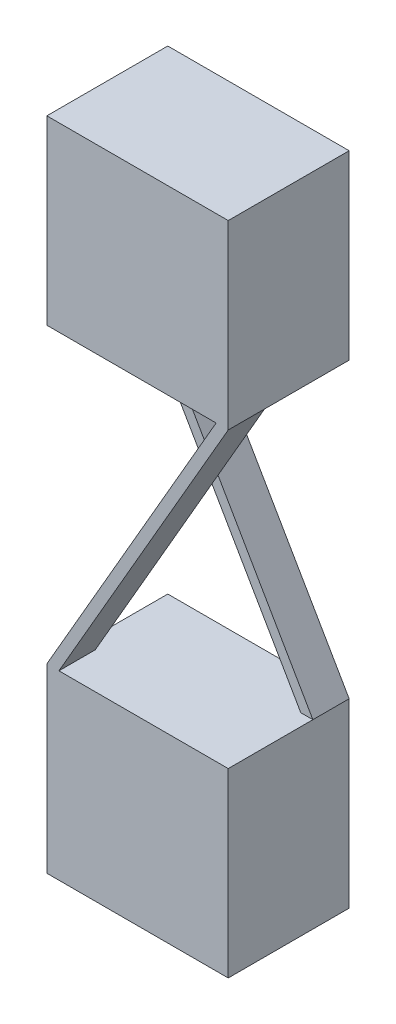
ISO-10303-21;
HEADER;
FILE_DESCRIPTION(('STEP AP214'),'2;1');
FILE_NAME('part.step','',(''),(''),'','','');
FILE_SCHEMA(('AUTOMOTIVE_DESIGN { 1 0 10303 214 1 1 1 1 }'));
ENDSEC;
DATA;
#1=APPLICATION_CONTEXT('core data for automotive mechanical design processes');
#2=APPLICATION_PROTOCOL_DEFINITION('international standard','automotive_design',2000,#1);
#3=PRODUCT_CONTEXT('',#1,'mechanical');
#4=PRODUCT('Part','Part','',(#3));
#5=PRODUCT_RELATED_PRODUCT_CATEGORY('part','',(#4));
#6=PRODUCT_DEFINITION_FORMATION('','',#4);
#7=PRODUCT_DEFINITION_CONTEXT('part definition',#1,'design');
#8=PRODUCT_DEFINITION('design','',#6,#7);
#9=PRODUCT_DEFINITION_SHAPE('','',#8);
#10=(LENGTH_UNIT() NAMED_UNIT(*) SI_UNIT(.MILLI.,.METRE.));
#11=(NAMED_UNIT(*) PLANE_ANGLE_UNIT() SI_UNIT($,.RADIAN.));
#12=(NAMED_UNIT(*) SI_UNIT($,.STERADIAN.) SOLID_ANGLE_UNIT());
#13=UNCERTAINTY_MEASURE_WITH_UNIT(LENGTH_MEASURE(1.E-05),#10,'distance_accuracy_value','');
#14=(GEOMETRIC_REPRESENTATION_CONTEXT(3) GLOBAL_UNCERTAINTY_ASSIGNED_CONTEXT((#13)) GLOBAL_UNIT_ASSIGNED_CONTEXT((#10,
#11,#12)) REPRESENTATION_CONTEXT('',''));
#15=CARTESIAN_POINT('',(0.,0.,0.));
#16=DIRECTION('',(0.,0.,1.));
#17=DIRECTION('',(1.,0.,0.));
#18=AXIS2_PLACEMENT_3D('',#15,#16,#17);
#19=CARTESIAN_POINT('',(0.,12.124355652982,5.));
#20=DIRECTION('',(0.,-1.,0.));
#21=DIRECTION('',(1.,0.,0.));
#22=AXIS2_PLACEMENT_3D('',#19,#20,#21);
#23=PLANE('',#22);
#24=DIRECTION('',(-1.,0.,0.));
#25=VECTOR('',#24,1.);
#26=CARTESIAN_POINT('',(0.,12.124355652982,-2.));
#27=LINE('',#26,#25);
#28=CARTESIAN_POINT('',(-6.5,12.124355652982,-2.));
#29=VERTEX_POINT('',#28);
#30=CARTESIAN_POINT('',(-7.50000000000001,12.124355652982,-2.));
#31=VERTEX_POINT('',#30);
#32=EDGE_CURVE('E157',#29,#31,#27,.T.);
#33=ORIENTED_EDGE('',*,*,#32,.F.);
#34=DIRECTION('',(0.,0.,-1.));
#35=VECTOR('',#34,1.);
#36=CARTESIAN_POINT('',(-6.5,12.124355652982,-2.));
#37=LINE('',#36,#35);
#38=CARTESIAN_POINT('',(-6.5,12.124355652982,-5.));
#39=VERTEX_POINT('',#38);
#40=EDGE_CURVE('E163',#29,#39,#37,.T.);
#41=ORIENTED_EDGE('',*,*,#40,.T.);
#42=DIRECTION('',(-1.,0.,0.));
#43=VECTOR('',#42,1.);
#44=CARTESIAN_POINT('',(0.,12.124355652982,-5.));
#45=LINE('',#44,#43);
#46=CARTESIAN_POINT('',(7.49999999999997,12.124355652982,-5.));
#47=VERTEX_POINT('',#46);
#48=EDGE_CURVE('E277',#47,#39,#45,.T.);
#49=ORIENTED_EDGE('',*,*,#48,.F.);
#50=DIRECTION('',(0.,0.,-1.));
#51=VECTOR('',#50,1.);
#52=CARTESIAN_POINT('',(7.49999999999997,12.124355652982,5.));
#53=LINE('',#52,#51);
#54=CARTESIAN_POINT('',(7.49999999999997,12.124355652982,2.));
#55=VERTEX_POINT('',#54);
#56=EDGE_CURVE('E287',#55,#47,#53,.T.);
#57=ORIENTED_EDGE('',*,*,#56,.F.);
#58=DIRECTION('',(1.,0.,0.));
#59=VECTOR('',#58,1.);
#60=CARTESIAN_POINT('',(0.,12.124355652982,2.));
#61=LINE('',#60,#59);
#62=CARTESIAN_POINT('',(6.50000000000002,12.124355652982,2.));
#63=VERTEX_POINT('',#62);
#64=EDGE_CURVE('E238',#63,#55,#61,.T.);
#65=ORIENTED_EDGE('',*,*,#64,.F.);
#66=DIRECTION('',(0.,0.,1.));
#67=VECTOR('',#66,1.);
#68=CARTESIAN_POINT('',(6.50000000000002,12.124355652982,2.));
#69=LINE('',#68,#67);
#70=CARTESIAN_POINT('',(6.50000000000002,12.124355652982,5.));
#71=VERTEX_POINT('',#70);
#72=EDGE_CURVE('E254',#63,#71,#69,.T.);
#73=ORIENTED_EDGE('',*,*,#72,.T.);
#74=DIRECTION('',(-1.,0.,0.));
#75=VECTOR('',#74,1.);
#76=CARTESIAN_POINT('',(0.,12.124355652982,5.));
#77=LINE('',#76,#75);
#78=CARTESIAN_POINT('',(-7.50000000000001,12.124355652982,5.));
#79=VERTEX_POINT('',#78);
#80=EDGE_CURVE('E284',#71,#79,#77,.T.);
#81=ORIENTED_EDGE('',*,*,#80,.T.);
#82=DIRECTION('',(0.,0.,-1.));
#83=VECTOR('',#82,1.);
#84=CARTESIAN_POINT('',(-7.50000000000001,12.124355652982,5.));
#85=LINE('',#84,#83);
#86=EDGE_CURVE('E175',#79,#31,#85,.T.);
#87=ORIENTED_EDGE('',*,*,#86,.T.);
#88=EDGE_LOOP('',(#33,#41,#49,#57,#65,#73,#81,#87));
#89=FACE_BOUND('',#88,.T.);
#90=ADVANCED_FACE('F51',(#89),#23,.T.);
#91=CARTESIAN_POINT('',(0.,-12.124355652982,5.));
#92=DIRECTION('',(0.,-1.,0.));
#93=DIRECTION('',(1.,0.,0.));
#94=AXIS2_PLACEMENT_3D('',#91,#92,#93);
#95=PLANE('',#94);
#96=DIRECTION('',(0.,0.,-1.));
#97=VECTOR('',#96,1.);
#98=CARTESIAN_POINT('',(6.49999999999997,-12.124355652982,-2.));
#99=LINE('',#98,#97);
#100=CARTESIAN_POINT('',(6.49999999999997,-12.124355652982,-2.));
#101=VERTEX_POINT('',#100);
#102=CARTESIAN_POINT('',(6.49999999999997,-12.124355652982,-5.));
#103=VERTEX_POINT('',#102);
#104=EDGE_CURVE('E192',#101,#103,#99,.T.);
#105=ORIENTED_EDGE('',*,*,#104,.T.);
#106=DIRECTION('',(-1.,0.,0.));
#107=VECTOR('',#106,1.);
#108=CARTESIAN_POINT('',(0.,-12.124355652982,-5.));
#109=LINE('',#108,#107);
#110=CARTESIAN_POINT('',(-7.5,-12.124355652982,-5.));
#111=VERTEX_POINT('',#110);
#112=EDGE_CURVE('E201',#103,#111,#109,.T.);
#113=ORIENTED_EDGE('',*,*,#112,.T.);
#114=DIRECTION('',(0.,0.,-1.));
#115=VECTOR('',#114,1.);
#116=CARTESIAN_POINT('',(-7.5,-12.124355652982,5.));
#117=LINE('',#116,#115);
#118=CARTESIAN_POINT('',(-7.5,-12.124355652982,2.));
#119=VERTEX_POINT('',#118);
#120=EDGE_CURVE('E212',#119,#111,#117,.T.);
#121=ORIENTED_EDGE('',*,*,#120,.F.);
#122=DIRECTION('',(1.,0.,0.));
#123=VECTOR('',#122,1.);
#124=CARTESIAN_POINT('',(0.,-12.124355652982,2.));
#125=LINE('',#124,#123);
#126=CARTESIAN_POINT('',(-6.49999999999997,-12.124355652982,2.));
#127=VERTEX_POINT('',#126);
#128=EDGE_CURVE('E246',#119,#127,#125,.T.);
#129=ORIENTED_EDGE('',*,*,#128,.T.);
#130=DIRECTION('',(0.,0.,1.));
#131=VECTOR('',#130,1.);
#132=CARTESIAN_POINT('',(-6.49999999999997,-12.124355652982,2.));
#133=LINE('',#132,#131);
#134=CARTESIAN_POINT('',(-6.49999999999997,-12.124355652982,5.));
#135=VERTEX_POINT('',#134);
#136=EDGE_CURVE('E267',#127,#135,#133,.T.);
#137=ORIENTED_EDGE('',*,*,#136,.T.);
#138=DIRECTION('',(-1.,0.,0.));
#139=VECTOR('',#138,1.);
#140=CARTESIAN_POINT('',(0.,-12.124355652982,5.));
#141=LINE('',#140,#139);
#142=CARTESIAN_POINT('',(7.49999999999997,-12.124355652982,5.));
#143=VERTEX_POINT('',#142);
#144=EDGE_CURVE('E208',#143,#135,#141,.T.);
#145=ORIENTED_EDGE('',*,*,#144,.F.);
#146=DIRECTION('',(0.,0.,-1.));
#147=VECTOR('',#146,1.);
#148=CARTESIAN_POINT('',(7.49999999999997,-12.124355652982,5.));
#149=LINE('',#148,#147);
#150=CARTESIAN_POINT('',(7.49999999999997,-12.124355652982,-2.));
#151=VERTEX_POINT('',#150);
#152=EDGE_CURVE('E228',#143,#151,#149,.T.);
#153=ORIENTED_EDGE('',*,*,#152,.T.);
#154=DIRECTION('',(-1.,0.,0.));
#155=VECTOR('',#154,1.);
#156=CARTESIAN_POINT('',(0.,-12.124355652982,-2.));
#157=LINE('',#156,#155);
#158=EDGE_CURVE('E67',#151,#101,#157,.T.);
#159=ORIENTED_EDGE('',*,*,#158,.T.);
#160=EDGE_LOOP('',(#105,#113,#121,#129,#137,#145,#153,#159));
#161=FACE_BOUND('',#160,.T.);
#162=ADVANCED_FACE('F325',(#161),#95,.F.);
#163=CARTESIAN_POINT('',(7.49999999999996,0.,5.));
#164=DIRECTION('',(1.,0.,0.));
#165=DIRECTION('',(0.,1.,0.));
#166=AXIS2_PLACEMENT_3D('',#163,#164,#165);
#167=PLANE('',#166);
#168=DIRECTION('',(0.,-1.,0.));
#169=VECTOR('',#168,1.);
#170=CARTESIAN_POINT('',(7.49999999999996,0.,-5.));
#171=LINE('',#170,#169);
#172=CARTESIAN_POINT('',(7.49999999999999,27.124355652982,-5.));
#173=VERTEX_POINT('',#172);
#174=EDGE_CURVE('E271',#173,#47,#171,.T.);
#175=ORIENTED_EDGE('',*,*,#174,.F.);
#176=DIRECTION('',(0.,0.,-1.));
#177=VECTOR('',#176,1.);
#178=CARTESIAN_POINT('',(7.49999999999999,27.124355652982,5.));
#179=LINE('',#178,#177);
#180=CARTESIAN_POINT('',(7.49999999999999,27.124355652982,5.));
#181=VERTEX_POINT('',#180);
#182=EDGE_CURVE('E11',#181,#173,#179,.T.);
#183=ORIENTED_EDGE('',*,*,#182,.F.);
#184=DIRECTION('',(0.,-1.,0.));
#185=VECTOR('',#184,1.);
#186=CARTESIAN_POINT('',(7.49999999999996,0.,5.));
#187=LINE('',#186,#185);
#188=CARTESIAN_POINT('',(7.49999999999997,12.124355652982,5.));
#189=VERTEX_POINT('',#188);
#190=EDGE_CURVE('E272',#181,#189,#187,.T.);
#191=ORIENTED_EDGE('',*,*,#190,.T.);
#192=EDGE_CURVE('E300',#189,#55,#53,.T.);
#193=ORIENTED_EDGE('',*,*,#192,.T.);
#194=ORIENTED_EDGE('',*,*,#56,.T.);
#195=EDGE_LOOP('',(#175,#183,#191,#193,#194));
#196=FACE_BOUND('',#195,.T.);
#197=ADVANCED_FACE('F53',(#196),#167,.T.);
#198=CARTESIAN_POINT('',(0.,27.124355652982,5.));
#199=DIRECTION('',(0.,-1.,0.));
#200=DIRECTION('',(1.,0.,0.));
#201=AXIS2_PLACEMENT_3D('',#198,#199,#200);
#202=PLANE('',#201);
#203=DIRECTION('',(-1.,0.,0.));
#204=VECTOR('',#203,1.);
#205=CARTESIAN_POINT('',(0.,27.124355652982,-5.));
#206=LINE('',#205,#204);
#207=CARTESIAN_POINT('',(-7.50000000000001,27.124355652982,-5.));
#208=VERTEX_POINT('',#207);
#209=EDGE_CURVE('E291',#173,#208,#206,.T.);
#210=ORIENTED_EDGE('',*,*,#209,.T.);
#211=DIRECTION('',(0.,0.,-1.));
#212=VECTOR('',#211,1.);
#213=CARTESIAN_POINT('',(-7.50000000000001,27.124355652982,5.));
#214=LINE('',#213,#212);
#215=CARTESIAN_POINT('',(-7.50000000000001,27.124355652982,5.));
#216=VERTEX_POINT('',#215);
#217=EDGE_CURVE('E60',#216,#208,#214,.T.);
#218=ORIENTED_EDGE('',*,*,#217,.F.);
#219=DIRECTION('',(-1.,0.,0.));
#220=VECTOR('',#219,1.);
#221=CARTESIAN_POINT('',(0.,27.124355652982,5.));
#222=LINE('',#221,#220);
#223=EDGE_CURVE('E276',#181,#216,#222,.T.);
#224=ORIENTED_EDGE('',*,*,#223,.F.);
#225=ORIENTED_EDGE('',*,*,#182,.T.);
#226=EDGE_LOOP('',(#210,#218,#224,#225));
#227=FACE_BOUND('',#226,.T.);
#228=ADVANCED_FACE('F372',(#227),#202,.F.);
#229=CARTESIAN_POINT('',(-7.50000000000001,0.,5.));
#230=DIRECTION('',(1.,0.,0.));
#231=DIRECTION('',(0.,0.,-1.));
#232=AXIS2_PLACEMENT_3D('',#229,#230,#231);
#233=PLANE('',#232);
#234=DIRECTION('',(0.,-1.,0.));
#235=VECTOR('',#234,1.);
#236=CARTESIAN_POINT('',(-7.50000000000001,0.,-5.));
#237=LINE('',#236,#235);
#238=CARTESIAN_POINT('',(-7.50000000000001,12.124355652982,-5.));
#239=VERTEX_POINT('',#238);
#240=EDGE_CURVE('E294',#208,#239,#237,.T.);
#241=ORIENTED_EDGE('',*,*,#240,.T.);
#242=DIRECTION('',(0.,0.,-1.));
#243=VECTOR('',#242,1.);
#244=CARTESIAN_POINT('',(-7.50000000000001,12.124355652982,-2.));
#245=LINE('',#244,#243);
#246=EDGE_CURVE('E171',#31,#239,#245,.T.);
#247=ORIENTED_EDGE('',*,*,#246,.F.);
#248=ORIENTED_EDGE('',*,*,#86,.F.);
#249=DIRECTION('',(0.,-1.,0.));
#250=VECTOR('',#249,1.);
#251=CARTESIAN_POINT('',(-7.50000000000001,0.,5.));
#252=LINE('',#251,#250);
#253=EDGE_CURVE('E280',#216,#79,#252,.T.);
#254=ORIENTED_EDGE('',*,*,#253,.F.);
#255=ORIENTED_EDGE('',*,*,#217,.T.);
#256=EDGE_LOOP('',(#241,#247,#248,#254,#255));
#257=FACE_BOUND('',#256,.T.);
#258=ADVANCED_FACE('F311',(#257),#233,.F.);
#259=CARTESIAN_POINT('',(0.,0.,5.));
#260=DIRECTION('',(0.,0.,1.));
#261=DIRECTION('',(1.,0.,0.));
#262=AXIS2_PLACEMENT_3D('',#259,#260,#261);
#263=PLANE('',#262);
#264=ORIENTED_EDGE('',*,*,#190,.F.);
#265=ORIENTED_EDGE('',*,*,#223,.T.);
#266=ORIENTED_EDGE('',*,*,#253,.T.);
#267=ORIENTED_EDGE('',*,*,#80,.F.);
#268=DIRECTION('',(-0.500000000000005,-0.866025403784436,0.));
#269=VECTOR('',#268,1.);
#270=CARTESIAN_POINT('',(-0.374999999999991,0.216506350946107,5.));
#271=LINE('',#270,#269);
#272=CARTESIAN_POINT('',(-7.5,-12.124355652982,5.));
#273=VERTEX_POINT('',#272);
#274=EDGE_CURVE('E242',#71,#273,#271,.T.);
#275=ORIENTED_EDGE('',*,*,#274,.T.);
#276=DIRECTION('',(0.,1.,0.));
#277=VECTOR('',#276,1.);
#278=CARTESIAN_POINT('',(-7.49999999999999,0.,5.));
#279=LINE('',#278,#277);
#280=CARTESIAN_POINT('',(-7.50000000000001,-27.124355652982,5.));
#281=VERTEX_POINT('',#280);
#282=EDGE_CURVE('E196',#281,#273,#279,.T.);
#283=ORIENTED_EDGE('',*,*,#282,.F.);
#284=DIRECTION('',(-1.,0.,0.));
#285=VECTOR('',#284,1.);
#286=CARTESIAN_POINT('',(0.,-27.124355652982,5.));
#287=LINE('',#286,#285);
#288=CARTESIAN_POINT('',(7.49999999999999,-27.124355652982,5.));
#289=VERTEX_POINT('',#288);
#290=EDGE_CURVE('E200',#289,#281,#287,.T.);
#291=ORIENTED_EDGE('',*,*,#290,.F.);
#292=DIRECTION('',(0.,1.,0.));
#293=VECTOR('',#292,1.);
#294=CARTESIAN_POINT('',(7.49999999999996,0.,5.));
#295=LINE('',#294,#293);
#296=EDGE_CURVE('E205',#289,#143,#295,.T.);
#297=ORIENTED_EDGE('',*,*,#296,.T.);
#298=ORIENTED_EDGE('',*,*,#144,.T.);
#299=DIRECTION('',(0.500000000000003,0.866025403784437,0.));
#300=VECTOR('',#299,1.);
#301=CARTESIAN_POINT('',(0.374999999999998,-0.21650635094611,5.));
#302=LINE('',#301,#300);
#303=EDGE_CURVE('E237',#135,#189,#302,.T.);
#304=ORIENTED_EDGE('',*,*,#303,.T.);
#305=EDGE_LOOP('',(#264,#265,#266,#267,#275,#283,#291,#297,#298,#304));
#306=FACE_BOUND('',#305,.T.);
#307=ADVANCED_FACE('F340',(#306),#263,.T.);
#308=CARTESIAN_POINT('',(0.,0.,-5.));
#309=DIRECTION('',(0.,0.,1.));
#310=DIRECTION('',(1.,0.,0.));
#311=AXIS2_PLACEMENT_3D('',#308,#309,#310);
#312=PLANE('',#311);
#313=ORIENTED_EDGE('',*,*,#174,.T.);
#314=ORIENTED_EDGE('',*,*,#48,.T.);
#315=DIRECTION('',(-0.500000000000004,0.866025403784436,0.));
#316=VECTOR('',#315,1.);
#317=CARTESIAN_POINT('',(0.374999999999987,0.216506350946105,-5.));
#318=LINE('',#317,#316);
#319=CARTESIAN_POINT('',(7.49999999999997,-12.124355652982,-5.));
#320=VERTEX_POINT('',#319);
#321=EDGE_CURVE('E166',#320,#39,#318,.T.);
#322=ORIENTED_EDGE('',*,*,#321,.F.);
#323=DIRECTION('',(0.,1.,0.));
#324=VECTOR('',#323,1.);
#325=CARTESIAN_POINT('',(7.49999999999996,0.,-5.));
#326=LINE('',#325,#324);
#327=CARTESIAN_POINT('',(7.49999999999999,-27.124355652982,-5.));
#328=VERTEX_POINT('',#327);
#329=EDGE_CURVE('E220',#328,#320,#326,.T.);
#330=ORIENTED_EDGE('',*,*,#329,.F.);
#331=DIRECTION('',(-1.,0.,0.));
#332=VECTOR('',#331,1.);
#333=CARTESIAN_POINT('',(0.,-27.124355652982,-5.));
#334=LINE('',#333,#332);
#335=CARTESIAN_POINT('',(-7.50000000000001,-27.124355652982,-5.));
#336=VERTEX_POINT('',#335);
#337=EDGE_CURVE('E216',#328,#336,#334,.T.);
#338=ORIENTED_EDGE('',*,*,#337,.T.);
#339=DIRECTION('',(0.,1.,0.));
#340=VECTOR('',#339,1.);
#341=CARTESIAN_POINT('',(-7.49999999999999,0.,-5.));
#342=LINE('',#341,#340);
#343=EDGE_CURVE('E195',#336,#111,#342,.T.);
#344=ORIENTED_EDGE('',*,*,#343,.T.);
#345=ORIENTED_EDGE('',*,*,#112,.F.);
#346=DIRECTION('',(0.500000000000004,-0.866025403784436,0.));
#347=VECTOR('',#346,1.);
#348=CARTESIAN_POINT('',(-0.375000000000011,-0.216506350946119,-5.));
#349=LINE('',#348,#347);
#350=EDGE_CURVE('E183',#239,#103,#349,.T.);
#351=ORIENTED_EDGE('',*,*,#350,.F.);
#352=ORIENTED_EDGE('',*,*,#240,.F.);
#353=ORIENTED_EDGE('',*,*,#209,.F.);
#354=EDGE_LOOP('',(#313,#314,#322,#330,#338,#344,#345,#351,#352,#353));
#355=FACE_BOUND('',#354,.T.);
#356=ADVANCED_FACE('F317',(#355),#312,.F.);
#357=CARTESIAN_POINT('',(0.374999999999998,-0.21650635094611,2.));
#358=DIRECTION('',(0.866025403784437,-0.500000000000003,0.));
#359=DIRECTION('',(0.500000000000003,0.866025403784437,0.));
#360=AXIS2_PLACEMENT_3D('',#357,#358,#359);
#361=PLANE('',#360);
#362=ORIENTED_EDGE('',*,*,#303,.F.);
#363=ORIENTED_EDGE('',*,*,#136,.F.);
#364=DIRECTION('',(0.500000000000003,0.866025403784437,0.));
#365=VECTOR('',#364,1.);
#366=CARTESIAN_POINT('',(0.374999999999998,-0.21650635094611,2.));
#367=LINE('',#366,#365);
#368=EDGE_CURVE('E241',#127,#55,#367,.T.);
#369=ORIENTED_EDGE('',*,*,#368,.T.);
#370=ORIENTED_EDGE('',*,*,#192,.F.);
#371=EDGE_LOOP('',(#362,#363,#369,#370));
#372=FACE_BOUND('',#371,.T.);
#373=ADVANCED_FACE('F351',(#372),#361,.T.);
#374=CARTESIAN_POINT('',(-0.374999999999991,0.216506350946107,2.));
#375=DIRECTION('',(-0.866025403784435,0.500000000000005,0.));
#376=DIRECTION('',(-0.500000000000005,-0.866025403784436,0.));
#377=AXIS2_PLACEMENT_3D('',#374,#375,#376);
#378=PLANE('',#377);
#379=ORIENTED_EDGE('',*,*,#274,.F.);
#380=ORIENTED_EDGE('',*,*,#72,.F.);
#381=DIRECTION('',(-0.500000000000005,-0.866025403784436,0.));
#382=VECTOR('',#381,1.);
#383=CARTESIAN_POINT('',(-0.374999999999991,0.216506350946107,2.));
#384=LINE('',#383,#382);
#385=EDGE_CURVE('E250',#63,#119,#384,.T.);
#386=ORIENTED_EDGE('',*,*,#385,.T.);
#387=DIRECTION('',(0.,0.,1.));
#388=VECTOR('',#387,1.);
#389=CARTESIAN_POINT('',(-7.5,-12.124355652982,2.));
#390=LINE('',#389,#388);
#391=EDGE_CURVE('E264',#119,#273,#390,.T.);
#392=ORIENTED_EDGE('',*,*,#391,.T.);
#393=EDGE_LOOP('',(#379,#380,#386,#392));
#394=FACE_BOUND('',#393,.T.);
#395=ADVANCED_FACE('F343',(#394),#378,.T.);
#396=CARTESIAN_POINT('',(0.,0.,2.));
#397=DIRECTION('',(0.,0.,1.));
#398=DIRECTION('',(1.,0.,0.));
#399=AXIS2_PLACEMENT_3D('',#396,#397,#398);
#400=PLANE('',#399);
#401=ORIENTED_EDGE('',*,*,#64,.T.);
#402=ORIENTED_EDGE('',*,*,#368,.F.);
#403=ORIENTED_EDGE('',*,*,#128,.F.);
#404=ORIENTED_EDGE('',*,*,#385,.F.);
#405=EDGE_LOOP('',(#401,#402,#403,#404));
#406=FACE_BOUND('',#405,.T.);
#407=ADVANCED_FACE('F349',(#406),#400,.F.);
#408=CARTESIAN_POINT('',(-7.49999999999999,0.,5.));
#409=DIRECTION('',(-1.,0.,0.));
#410=DIRECTION('',(0.,-1.,0.));
#411=AXIS2_PLACEMENT_3D('',#408,#409,#410);
#412=PLANE('',#411);
#413=ORIENTED_EDGE('',*,*,#343,.F.);
#414=DIRECTION('',(0.,0.,-1.));
#415=VECTOR('',#414,1.);
#416=CARTESIAN_POINT('',(-7.50000000000001,-27.124355652982,5.));
#417=LINE('',#416,#415);
#418=EDGE_CURVE('E234',#281,#336,#417,.T.);
#419=ORIENTED_EDGE('',*,*,#418,.F.);
#420=ORIENTED_EDGE('',*,*,#282,.T.);
#421=ORIENTED_EDGE('',*,*,#391,.F.);
#422=ORIENTED_EDGE('',*,*,#120,.T.);
#423=EDGE_LOOP('',(#413,#419,#420,#421,#422));
#424=FACE_BOUND('',#423,.T.);
#425=ADVANCED_FACE('F330',(#424),#412,.T.);
#426=CARTESIAN_POINT('',(0.,-27.124355652982,5.));
#427=DIRECTION('',(0.,-1.,0.));
#428=DIRECTION('',(1.,0.,0.));
#429=AXIS2_PLACEMENT_3D('',#426,#427,#428);
#430=PLANE('',#429);
#431=ORIENTED_EDGE('',*,*,#337,.F.);
#432=DIRECTION('',(0.,0.,-1.));
#433=VECTOR('',#432,1.);
#434=CARTESIAN_POINT('',(7.49999999999999,-27.124355652982,5.));
#435=LINE('',#434,#433);
#436=EDGE_CURVE('E231',#289,#328,#435,.T.);
#437=ORIENTED_EDGE('',*,*,#436,.F.);
#438=ORIENTED_EDGE('',*,*,#290,.T.);
#439=ORIENTED_EDGE('',*,*,#418,.T.);
#440=EDGE_LOOP('',(#431,#437,#438,#439));
#441=FACE_BOUND('',#440,.T.);
#442=ADVANCED_FACE('F334',(#441),#430,.T.);
#443=CARTESIAN_POINT('',(7.49999999999996,0.,5.));
#444=DIRECTION('',(-1.,0.,0.));
#445=DIRECTION('',(0.,-1.,0.));
#446=AXIS2_PLACEMENT_3D('',#443,#444,#445);
#447=PLANE('',#446);
#448=ORIENTED_EDGE('',*,*,#329,.T.);
#449=DIRECTION('',(0.,0.,-1.));
#450=VECTOR('',#449,1.);
#451=CARTESIAN_POINT('',(7.49999999999997,-12.124355652982,-2.));
#452=LINE('',#451,#450);
#453=EDGE_CURVE('E75',#151,#320,#452,.T.);
#454=ORIENTED_EDGE('',*,*,#453,.F.);
#455=ORIENTED_EDGE('',*,*,#152,.F.);
#456=ORIENTED_EDGE('',*,*,#296,.F.);
#457=ORIENTED_EDGE('',*,*,#436,.T.);
#458=EDGE_LOOP('',(#448,#454,#455,#456,#457));
#459=FACE_BOUND('',#458,.T.);
#460=ADVANCED_FACE('F353',(#459),#447,.F.);
#461=CARTESIAN_POINT('',(-0.375000000000011,-0.216506350946119,-2.));
#462=DIRECTION('',(0.866025403784436,0.500000000000004,0.));
#463=DIRECTION('',(-0.500000000000004,0.866025403784436,0.));
#464=AXIS2_PLACEMENT_3D('',#461,#462,#463);
#465=PLANE('',#464);
#466=ORIENTED_EDGE('',*,*,#350,.T.);
#467=ORIENTED_EDGE('',*,*,#104,.F.);
#468=DIRECTION('',(0.500000000000004,-0.866025403784436,0.));
#469=VECTOR('',#468,1.);
#470=CARTESIAN_POINT('',(-0.375000000000011,-0.216506350946119,-2.));
#471=LINE('',#470,#469);
#472=EDGE_CURVE('E188',#31,#101,#471,.T.);
#473=ORIENTED_EDGE('',*,*,#472,.F.);
#474=ORIENTED_EDGE('',*,*,#246,.T.);
#475=EDGE_LOOP('',(#466,#467,#473,#474));
#476=FACE_BOUND('',#475,.T.);
#477=ADVANCED_FACE('F321',(#476),#465,.F.);
#478=CARTESIAN_POINT('',(0.374999999999987,0.216506350946105,-2.));
#479=DIRECTION('',(-0.866025403784436,-0.500000000000004,0.));
#480=DIRECTION('',(0.500000000000004,-0.866025403784436,0.));
#481=AXIS2_PLACEMENT_3D('',#478,#479,#480);
#482=PLANE('',#481);
#483=ORIENTED_EDGE('',*,*,#321,.T.);
#484=ORIENTED_EDGE('',*,*,#40,.F.);
#485=DIRECTION('',(-0.500000000000004,0.866025403784436,0.));
#486=VECTOR('',#485,1.);
#487=CARTESIAN_POINT('',(0.374999999999987,0.216506350946105,-2.));
#488=LINE('',#487,#486);
#489=EDGE_CURVE('E153',#151,#29,#488,.T.);
#490=ORIENTED_EDGE('',*,*,#489,.F.);
#491=ORIENTED_EDGE('',*,*,#453,.T.);
#492=EDGE_LOOP('',(#483,#484,#490,#491));
#493=FACE_BOUND('',#492,.T.);
#494=ADVANCED_FACE('F164',(#493),#482,.F.);
#495=CARTESIAN_POINT('',(0.,0.,-2.));
#496=DIRECTION('',(0.,0.,-1.));
#497=DIRECTION('',(-1.,0.,0.));
#498=AXIS2_PLACEMENT_3D('',#495,#496,#497);
#499=PLANE('',#498);
#500=ORIENTED_EDGE('',*,*,#472,.T.);
#501=ORIENTED_EDGE('',*,*,#158,.F.);
#502=ORIENTED_EDGE('',*,*,#489,.T.);
#503=ORIENTED_EDGE('',*,*,#32,.T.);
#504=EDGE_LOOP('',(#500,#501,#502,#503));
#505=FACE_BOUND('',#504,.T.);
#506=ADVANCED_FACE('F155',(#505),#499,.F.);
#507=CLOSED_SHELL('',(#90,#162,#197,#228,#258,#307,#356,#373,#395,#407,#425,#442,#460,#477,#494,#506));
#508=MANIFOLD_SOLID_BREP('B2',#507);
#509=ADVANCED_BREP_SHAPE_REPRESENTATION('',(#18,#508),#14);
#510=SHAPE_DEFINITION_REPRESENTATION(#9,#509);
ENDSEC;
END-ISO-10303-21;
